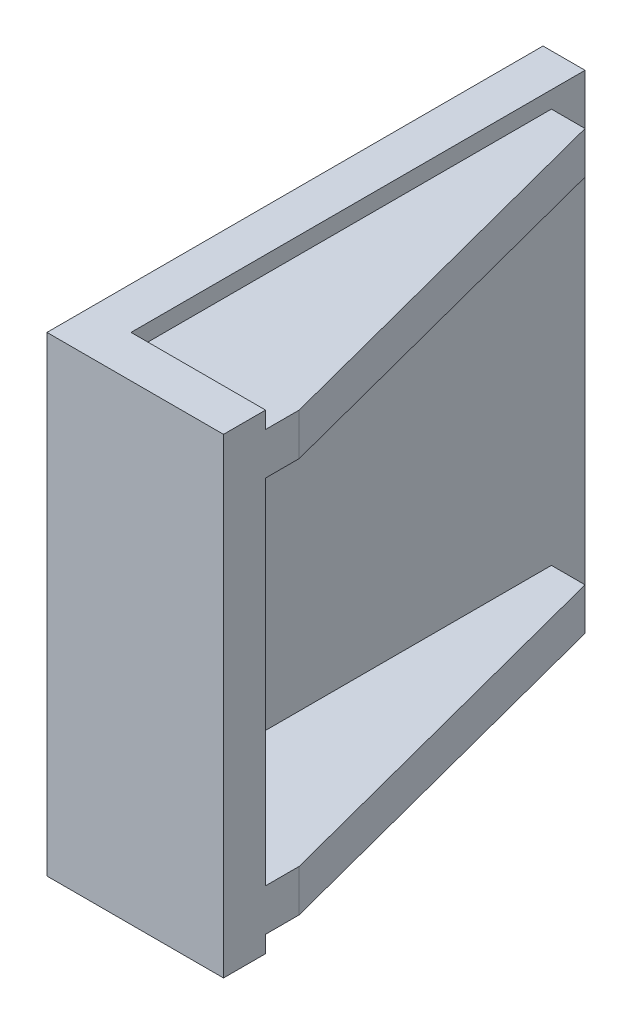
ISO-10303-21;
HEADER;
FILE_DESCRIPTION(('STEP AP214'),'2;1');
FILE_NAME('part.step','',(''),(''),'','','');
FILE_SCHEMA(('AUTOMOTIVE_DESIGN { 1 0 10303 214 1 1 1 1 }'));
ENDSEC;
DATA;
#1=APPLICATION_CONTEXT('core data for automotive mechanical design processes');
#2=APPLICATION_PROTOCOL_DEFINITION('international standard','automotive_design',2000,#1);
#3=PRODUCT_CONTEXT('',#1,'mechanical');
#4=PRODUCT('Part','Part','',(#3));
#5=PRODUCT_RELATED_PRODUCT_CATEGORY('part','',(#4));
#6=PRODUCT_DEFINITION_FORMATION('','',#4);
#7=PRODUCT_DEFINITION_CONTEXT('part definition',#1,'design');
#8=PRODUCT_DEFINITION('design','',#6,#7);
#9=PRODUCT_DEFINITION_SHAPE('','',#8);
#10=(LENGTH_UNIT() NAMED_UNIT(*) SI_UNIT(.MILLI.,.METRE.));
#11=(NAMED_UNIT(*) PLANE_ANGLE_UNIT() SI_UNIT($,.RADIAN.));
#12=(NAMED_UNIT(*) SI_UNIT($,.STERADIAN.) SOLID_ANGLE_UNIT());
#13=UNCERTAINTY_MEASURE_WITH_UNIT(LENGTH_MEASURE(1.E-05),#10,'distance_accuracy_value','');
#14=(GEOMETRIC_REPRESENTATION_CONTEXT(3) GLOBAL_UNCERTAINTY_ASSIGNED_CONTEXT((#13)) GLOBAL_UNIT_ASSIGNED_CONTEXT((#10,
#11,#12)) REPRESENTATION_CONTEXT('',''));
#15=CARTESIAN_POINT('',(0.,0.,0.));
#16=DIRECTION('',(0.,0.,1.));
#17=DIRECTION('',(1.,0.,0.));
#18=AXIS2_PLACEMENT_3D('',#15,#16,#17);
#19=CARTESIAN_POINT('',(12.5,-223.815273071201,122.5));
#20=DIRECTION('',(0.,0.,-1.));
#21=DIRECTION('',(-1.,0.,0.));
#22=AXIS2_PLACEMENT_3D('',#19,#20,#21);
#23=PLANE('',#22);
#24=DIRECTION('',(0.,1.,0.));
#25=VECTOR('',#24,1.);
#26=CARTESIAN_POINT('',(12.5,-223.815273071201,122.5));
#27=LINE('',#26,#25);
#28=CARTESIAN_POINT('',(12.5,-140.,122.5));
#29=VERTEX_POINT('',#28);
#30=CARTESIAN_POINT('',(12.5,-130.,122.5));
#31=VERTEX_POINT('',#30);
#32=EDGE_CURVE('E228',#29,#31,#27,.T.);
#33=ORIENTED_EDGE('',*,*,#32,.T.);
#34=DIRECTION('',(1.,0.,0.));
#35=VECTOR('',#34,1.);
#36=CARTESIAN_POINT('',(92.5,-130.,122.5));
#37=LINE('',#36,#35);
#38=CARTESIAN_POINT('',(92.5,-130.,122.5));
#39=VERTEX_POINT('',#38);
#40=EDGE_CURVE('E173',#31,#39,#37,.T.);
#41=ORIENTED_EDGE('',*,*,#40,.T.);
#42=DIRECTION('',(0.,1.,0.));
#43=VECTOR('',#42,1.);
#44=CARTESIAN_POINT('',(92.5,-223.815273071201,122.5));
#45=LINE('',#44,#43);
#46=CARTESIAN_POINT('',(92.5,-140.,122.5));
#47=VERTEX_POINT('',#46);
#48=EDGE_CURVE('E240',#47,#39,#45,.T.);
#49=ORIENTED_EDGE('',*,*,#48,.F.);
#50=DIRECTION('',(1.,0.,0.));
#51=VECTOR('',#50,1.);
#52=CARTESIAN_POINT('',(12.5,-140.,122.5));
#53=LINE('',#52,#51);
#54=EDGE_CURVE('E227',#29,#47,#53,.T.);
#55=ORIENTED_EDGE('',*,*,#54,.F.);
#56=EDGE_LOOP('',(#33,#41,#49,#55));
#57=FACE_BOUND('',#56,.T.);
#58=ADVANCED_FACE('F35',(#57),#23,.T.);
#59=CARTESIAN_POINT('',(92.5,130.,122.5));
#60=VERTEX_POINT('',#59);
#61=CARTESIAN_POINT('',(92.5,140.,122.5));
#62=VERTEX_POINT('',#61);
#63=EDGE_CURVE('E244',#60,#62,#45,.T.);
#64=ORIENTED_EDGE('',*,*,#63,.F.);
#65=DIRECTION('',(1.,0.,0.));
#66=VECTOR('',#65,1.);
#67=CARTESIAN_POINT('',(92.5,130.,122.5));
#68=LINE('',#67,#66);
#69=CARTESIAN_POINT('',(12.5,130.,122.5));
#70=VERTEX_POINT('',#69);
#71=EDGE_CURVE('E58',#70,#60,#68,.T.);
#72=ORIENTED_EDGE('',*,*,#71,.F.);
#73=CARTESIAN_POINT('',(12.5,140.,122.5));
#74=VERTEX_POINT('',#73);
#75=EDGE_CURVE('E239',#70,#74,#27,.T.);
#76=ORIENTED_EDGE('',*,*,#75,.T.);
#77=DIRECTION('',(-1.,0.,0.));
#78=VECTOR('',#77,1.);
#79=CARTESIAN_POINT('',(12.5,140.,122.5));
#80=LINE('',#79,#78);
#81=EDGE_CURVE('E233',#62,#74,#80,.T.);
#82=ORIENTED_EDGE('',*,*,#81,.F.);
#83=EDGE_LOOP('',(#64,#72,#76,#82));
#84=FACE_BOUND('',#83,.T.);
#85=ADVANCED_FACE('F293',(#84),#23,.T.);
#86=CARTESIAN_POINT('',(12.5,140.,147.5));
#87=DIRECTION('',(-1.,0.,0.));
#88=DIRECTION('',(0.,-1.,0.));
#89=AXIS2_PLACEMENT_3D('',#86,#87,#88);
#90=PLANE('',#89);
#91=CARTESIAN_POINT('',(12.5,-105.,122.5));
#92=VERTEX_POINT('',#91);
#93=CARTESIAN_POINT('',(12.5,105.,122.5));
#94=VERTEX_POINT('',#93);
#95=EDGE_CURVE('E172',#92,#94,#27,.T.);
#96=ORIENTED_EDGE('',*,*,#95,.F.);
#97=DIRECTION('',(0.,0.,1.));
#98=VECTOR('',#97,1.);
#99=CARTESIAN_POINT('',(12.5,-105.,122.5));
#100=LINE('',#99,#98);
#101=CARTESIAN_POINT('',(12.5,-105.,-127.5));
#102=VERTEX_POINT('',#101);
#103=EDGE_CURVE('E151',#102,#92,#100,.T.);
#104=ORIENTED_EDGE('',*,*,#103,.F.);
#105=DIRECTION('',(0.,-1.,0.));
#106=VECTOR('',#105,1.);
#107=CARTESIAN_POINT('',(12.5,-105.,-127.5));
#108=LINE('',#107,#106);
#109=CARTESIAN_POINT('',(12.5,-130.,-127.5));
#110=VERTEX_POINT('',#109);
#111=EDGE_CURVE('E160',#102,#110,#108,.T.);
#112=ORIENTED_EDGE('',*,*,#111,.T.);
#113=DIRECTION('',(0.,0.,1.));
#114=VECTOR('',#113,1.);
#115=CARTESIAN_POINT('',(12.5,-130.,122.5));
#116=LINE('',#115,#114);
#117=EDGE_CURVE('E182',#110,#31,#116,.T.);
#118=ORIENTED_EDGE('',*,*,#117,.T.);
#119=ORIENTED_EDGE('',*,*,#32,.F.);
#120=DIRECTION('',(0.,0.,-1.));
#121=VECTOR('',#120,1.);
#122=CARTESIAN_POINT('',(12.5,-140.,147.5));
#123=LINE('',#122,#121);
#124=CARTESIAN_POINT('',(12.5,-140.,-147.5));
#125=VERTEX_POINT('',#124);
#126=EDGE_CURVE('E254',#29,#125,#123,.T.);
#127=ORIENTED_EDGE('',*,*,#126,.T.);
#128=DIRECTION('',(0.,1.,0.));
#129=VECTOR('',#128,1.);
#130=CARTESIAN_POINT('',(12.5,140.,-147.5));
#131=LINE('',#130,#129);
#132=CARTESIAN_POINT('',(12.5,140.,-147.5));
#133=VERTEX_POINT('',#132);
#134=EDGE_CURVE('E230',#125,#133,#131,.T.);
#135=ORIENTED_EDGE('',*,*,#134,.T.);
#136=DIRECTION('',(0.,0.,-1.));
#137=VECTOR('',#136,1.);
#138=CARTESIAN_POINT('',(12.5,140.,147.5));
#139=LINE('',#138,#137);
#140=EDGE_CURVE('E11',#74,#133,#139,.T.);
#141=ORIENTED_EDGE('',*,*,#140,.F.);
#142=ORIENTED_EDGE('',*,*,#75,.F.);
#143=DIRECTION('',(0.,0.,1.));
#144=VECTOR('',#143,1.);
#145=CARTESIAN_POINT('',(12.5,130.,122.5));
#146=LINE('',#145,#144);
#147=CARTESIAN_POINT('',(12.5,130.,-127.5));
#148=VERTEX_POINT('',#147);
#149=EDGE_CURVE('E191',#148,#70,#146,.T.);
#150=ORIENTED_EDGE('',*,*,#149,.F.);
#151=DIRECTION('',(0.,1.,0.));
#152=VECTOR('',#151,1.);
#153=CARTESIAN_POINT('',(12.5,105.,-127.5));
#154=LINE('',#153,#152);
#155=CARTESIAN_POINT('',(12.5,105.,-127.5));
#156=VERTEX_POINT('',#155);
#157=EDGE_CURVE('E218',#156,#148,#154,.T.);
#158=ORIENTED_EDGE('',*,*,#157,.F.);
#159=DIRECTION('',(0.,0.,1.));
#160=VECTOR('',#159,1.);
#161=CARTESIAN_POINT('',(12.5,105.,122.5));
#162=LINE('',#161,#160);
#163=EDGE_CURVE('E193',#156,#94,#162,.T.);
#164=ORIENTED_EDGE('',*,*,#163,.T.);
#165=EDGE_LOOP('',(#96,#104,#112,#118,#119,#127,#135,#141,#142,#150,#158,#164));
#166=FACE_BOUND('',#165,.T.);
#167=ADVANCED_FACE('F37',(#166),#90,.F.);
#168=CARTESIAN_POINT('',(-12.5,140.,147.5));
#169=DIRECTION('',(0.,-1.,0.));
#170=DIRECTION('',(0.,0.,-1.));
#171=AXIS2_PLACEMENT_3D('',#168,#169,#170);
#172=PLANE('',#171);
#173=DIRECTION('',(-1.,0.,0.));
#174=VECTOR('',#173,1.);
#175=CARTESIAN_POINT('',(-12.5,140.,-147.5));
#176=LINE('',#175,#174);
#177=CARTESIAN_POINT('',(-12.5,140.,-147.5));
#178=VERTEX_POINT('',#177);
#179=EDGE_CURVE('E257',#133,#178,#176,.T.);
#180=ORIENTED_EDGE('',*,*,#179,.T.);
#181=DIRECTION('',(0.,0.,-1.));
#182=VECTOR('',#181,1.);
#183=CARTESIAN_POINT('',(-12.5,140.,147.5));
#184=LINE('',#183,#182);
#185=CARTESIAN_POINT('',(-12.5,140.,147.5));
#186=VERTEX_POINT('',#185);
#187=EDGE_CURVE('E43',#186,#178,#184,.T.);
#188=ORIENTED_EDGE('',*,*,#187,.F.);
#189=DIRECTION('',(-1.,0.,0.));
#190=VECTOR('',#189,1.);
#191=CARTESIAN_POINT('',(-12.5,140.,147.5));
#192=LINE('',#191,#190);
#193=CARTESIAN_POINT('',(92.5,140.,147.5));
#194=VERTEX_POINT('',#193);
#195=EDGE_CURVE('E247',#194,#186,#192,.T.);
#196=ORIENTED_EDGE('',*,*,#195,.F.);
#197=DIRECTION('',(0.,0.,-1.));
#198=VECTOR('',#197,1.);
#199=CARTESIAN_POINT('',(92.5,140.,147.5));
#200=LINE('',#199,#198);
#201=EDGE_CURVE('E220',#194,#62,#200,.T.);
#202=ORIENTED_EDGE('',*,*,#201,.T.);
#203=ORIENTED_EDGE('',*,*,#81,.T.);
#204=ORIENTED_EDGE('',*,*,#140,.T.);
#205=EDGE_LOOP('',(#180,#188,#196,#202,#203,#204));
#206=FACE_BOUND('',#205,.T.);
#207=ADVANCED_FACE('F289',(#206),#172,.F.);
#208=CARTESIAN_POINT('',(-12.5,140.,147.5));
#209=DIRECTION('',(1.,0.,0.));
#210=DIRECTION('',(0.,1.,0.));
#211=AXIS2_PLACEMENT_3D('',#208,#209,#210);
#212=PLANE('',#211);
#213=DIRECTION('',(0.,-1.,0.));
#214=VECTOR('',#213,1.);
#215=CARTESIAN_POINT('',(-12.5,140.,-147.5));
#216=LINE('',#215,#214);
#217=CARTESIAN_POINT('',(-12.5,-140.,-147.5));
#218=VERTEX_POINT('',#217);
#219=EDGE_CURVE('E259',#178,#218,#216,.T.);
#220=ORIENTED_EDGE('',*,*,#219,.T.);
#221=DIRECTION('',(0.,0.,-1.));
#222=VECTOR('',#221,1.);
#223=CARTESIAN_POINT('',(-12.5,-140.,147.5));
#224=LINE('',#223,#222);
#225=CARTESIAN_POINT('',(-12.5,-140.,147.5));
#226=VERTEX_POINT('',#225);
#227=EDGE_CURVE('E264',#226,#218,#224,.T.);
#228=ORIENTED_EDGE('',*,*,#227,.F.);
#229=DIRECTION('',(0.,-1.,0.));
#230=VECTOR('',#229,1.);
#231=CARTESIAN_POINT('',(-12.5,140.,147.5));
#232=LINE('',#231,#230);
#233=EDGE_CURVE('E249',#186,#226,#232,.T.);
#234=ORIENTED_EDGE('',*,*,#233,.F.);
#235=ORIENTED_EDGE('',*,*,#187,.T.);
#236=EDGE_LOOP('',(#220,#228,#234,#235));
#237=FACE_BOUND('',#236,.T.);
#238=ADVANCED_FACE('F271',(#237),#212,.F.);
#239=CARTESIAN_POINT('',(-12.5,-140.,147.5));
#240=DIRECTION('',(0.,1.,0.));
#241=DIRECTION('',(0.,0.,1.));
#242=AXIS2_PLACEMENT_3D('',#239,#240,#241);
#243=PLANE('',#242);
#244=DIRECTION('',(1.,0.,0.));
#245=VECTOR('',#244,1.);
#246=CARTESIAN_POINT('',(-12.5,-140.,-147.5));
#247=LINE('',#246,#245);
#248=EDGE_CURVE('E250',#218,#125,#247,.T.);
#249=ORIENTED_EDGE('',*,*,#248,.T.);
#250=ORIENTED_EDGE('',*,*,#126,.F.);
#251=ORIENTED_EDGE('',*,*,#54,.T.);
#252=DIRECTION('',(0.,0.,1.));
#253=VECTOR('',#252,1.);
#254=CARTESIAN_POINT('',(92.5,-140.,147.5));
#255=LINE('',#254,#253);
#256=CARTESIAN_POINT('',(92.5,-140.,147.5));
#257=VERTEX_POINT('',#256);
#258=EDGE_CURVE('E224',#47,#257,#255,.T.);
#259=ORIENTED_EDGE('',*,*,#258,.T.);
#260=DIRECTION('',(1.,0.,0.));
#261=VECTOR('',#260,1.);
#262=CARTESIAN_POINT('',(-12.5,-140.,147.5));
#263=LINE('',#262,#261);
#264=EDGE_CURVE('E252',#226,#257,#263,.T.);
#265=ORIENTED_EDGE('',*,*,#264,.F.);
#266=ORIENTED_EDGE('',*,*,#227,.T.);
#267=EDGE_LOOP('',(#249,#250,#251,#259,#265,#266));
#268=FACE_BOUND('',#267,.T.);
#269=ADVANCED_FACE('F281',(#268),#243,.F.);
#270=CARTESIAN_POINT('',(0.,0.,147.5));
#271=DIRECTION('',(0.,0.,1.));
#272=DIRECTION('',(1.,0.,0.));
#273=AXIS2_PLACEMENT_3D('',#270,#271,#272);
#274=PLANE('',#273);
#275=ORIENTED_EDGE('',*,*,#264,.T.);
#276=DIRECTION('',(0.,1.,0.));
#277=VECTOR('',#276,1.);
#278=CARTESIAN_POINT('',(92.5,-223.815273071201,147.5));
#279=LINE('',#278,#277);
#280=EDGE_CURVE('E236',#257,#194,#279,.T.);
#281=ORIENTED_EDGE('',*,*,#280,.T.);
#282=ORIENTED_EDGE('',*,*,#195,.T.);
#283=ORIENTED_EDGE('',*,*,#233,.T.);
#284=EDGE_LOOP('',(#275,#281,#282,#283));
#285=FACE_BOUND('',#284,.T.);
#286=ADVANCED_FACE('F287',(#285),#274,.T.);
#287=CARTESIAN_POINT('',(0.,0.,-147.5));
#288=DIRECTION('',(0.,0.,1.));
#289=DIRECTION('',(1.,0.,0.));
#290=AXIS2_PLACEMENT_3D('',#287,#288,#289);
#291=PLANE('',#290);
#292=ORIENTED_EDGE('',*,*,#134,.F.);
#293=ORIENTED_EDGE('',*,*,#248,.F.);
#294=ORIENTED_EDGE('',*,*,#219,.F.);
#295=ORIENTED_EDGE('',*,*,#179,.F.);
#296=EDGE_LOOP('',(#292,#293,#294,#295));
#297=FACE_BOUND('',#296,.T.);
#298=ADVANCED_FACE('F278',(#297),#291,.F.);
#299=DIRECTION('',(1.,0.,0.));
#300=VECTOR('',#299,1.);
#301=CARTESIAN_POINT('',(92.5,-105.,122.5));
#302=LINE('',#301,#300);
#303=CARTESIAN_POINT('',(92.5,-105.,122.5));
#304=VERTEX_POINT('',#303);
#305=EDGE_CURVE('E168',#92,#304,#302,.T.);
#306=ORIENTED_EDGE('',*,*,#305,.F.);
#307=ORIENTED_EDGE('',*,*,#95,.T.);
#308=DIRECTION('',(1.,0.,0.));
#309=VECTOR('',#308,1.);
#310=CARTESIAN_POINT('',(92.5,105.,122.5));
#311=LINE('',#310,#309);
#312=CARTESIAN_POINT('',(92.5,105.,122.5));
#313=VERTEX_POINT('',#312);
#314=EDGE_CURVE('E195',#94,#313,#311,.T.);
#315=ORIENTED_EDGE('',*,*,#314,.T.);
#316=EDGE_CURVE('E243',#304,#313,#45,.T.);
#317=ORIENTED_EDGE('',*,*,#316,.F.);
#318=EDGE_LOOP('',(#306,#307,#315,#317));
#319=FACE_BOUND('',#318,.T.);
#320=ADVANCED_FACE('F314',(#319),#23,.T.);
#321=CARTESIAN_POINT('',(92.5,-223.815273071201,147.5));
#322=DIRECTION('',(1.,0.,0.));
#323=DIRECTION('',(0.,0.,-1.));
#324=AXIS2_PLACEMENT_3D('',#321,#322,#323);
#325=PLANE('',#324);
#326=ORIENTED_EDGE('',*,*,#258,.F.);
#327=ORIENTED_EDGE('',*,*,#48,.T.);
#328=DIRECTION('',(0.,0.,-1.));
#329=VECTOR('',#328,1.);
#330=CARTESIAN_POINT('',(92.5,-130.,102.5));
#331=LINE('',#330,#329);
#332=CARTESIAN_POINT('',(92.5,-130.,102.5));
#333=VERTEX_POINT('',#332);
#334=EDGE_CURVE('E176',#39,#333,#331,.T.);
#335=ORIENTED_EDGE('',*,*,#334,.T.);
#336=DIRECTION('',(0.,-1.,0.));
#337=VECTOR('',#336,1.);
#338=CARTESIAN_POINT('',(92.5,-105.,102.5));
#339=LINE('',#338,#337);
#340=CARTESIAN_POINT('',(92.5,-105.,102.5));
#341=VERTEX_POINT('',#340);
#342=EDGE_CURVE('E188',#341,#333,#339,.T.);
#343=ORIENTED_EDGE('',*,*,#342,.F.);
#344=DIRECTION('',(0.,0.,-1.));
#345=VECTOR('',#344,1.);
#346=CARTESIAN_POINT('',(92.5,-105.,102.5));
#347=LINE('',#346,#345);
#348=EDGE_CURVE('E50',#304,#341,#347,.T.);
#349=ORIENTED_EDGE('',*,*,#348,.F.);
#350=ORIENTED_EDGE('',*,*,#316,.T.);
#351=DIRECTION('',(0.,0.,-1.));
#352=VECTOR('',#351,1.);
#353=CARTESIAN_POINT('',(92.5,105.,102.5));
#354=LINE('',#353,#352);
#355=CARTESIAN_POINT('',(92.5,105.,102.5));
#356=VERTEX_POINT('',#355);
#357=EDGE_CURVE('E199',#313,#356,#354,.T.);
#358=ORIENTED_EDGE('',*,*,#357,.T.);
#359=DIRECTION('',(0.,1.,0.));
#360=VECTOR('',#359,1.);
#361=CARTESIAN_POINT('',(92.5,105.,102.5));
#362=LINE('',#361,#360);
#363=CARTESIAN_POINT('',(92.5,130.,102.5));
#364=VERTEX_POINT('',#363);
#365=EDGE_CURVE('E208',#356,#364,#362,.T.);
#366=ORIENTED_EDGE('',*,*,#365,.T.);
#367=DIRECTION('',(0.,0.,-1.));
#368=VECTOR('',#367,1.);
#369=CARTESIAN_POINT('',(92.5,130.,102.5));
#370=LINE('',#369,#368);
#371=EDGE_CURVE('E211',#60,#364,#370,.T.);
#372=ORIENTED_EDGE('',*,*,#371,.F.);
#373=ORIENTED_EDGE('',*,*,#63,.T.);
#374=ORIENTED_EDGE('',*,*,#201,.F.);
#375=ORIENTED_EDGE('',*,*,#280,.F.);
#376=EDGE_LOOP('',(#326,#327,#335,#343,#349,#350,#358,#366,#372,#373,#374,#375));
#377=FACE_BOUND('',#376,.T.);
#378=ADVANCED_FACE('F299',(#377),#325,.T.);
#379=CARTESIAN_POINT('',(12.5,105.,-127.5));
#380=DIRECTION('',(0.,0.,-1.));
#381=DIRECTION('',(-1.,0.,0.));
#382=AXIS2_PLACEMENT_3D('',#379,#380,#381);
#383=PLANE('',#382);
#384=DIRECTION('',(-1.,0.,0.));
#385=VECTOR('',#384,1.);
#386=CARTESIAN_POINT('',(12.5,130.,-127.5));
#387=LINE('',#386,#385);
#388=CARTESIAN_POINT('',(32.5,130.,-127.5));
#389=VERTEX_POINT('',#388);
#390=EDGE_CURVE('E196',#389,#148,#387,.T.);
#391=ORIENTED_EDGE('',*,*,#390,.F.);
#392=DIRECTION('',(0.,1.,0.));
#393=VECTOR('',#392,1.);
#394=CARTESIAN_POINT('',(32.5,105.,-127.5));
#395=LINE('',#394,#393);
#396=CARTESIAN_POINT('',(32.5,105.,-127.5));
#397=VERTEX_POINT('',#396);
#398=EDGE_CURVE('E221',#397,#389,#395,.T.);
#399=ORIENTED_EDGE('',*,*,#398,.F.);
#400=DIRECTION('',(-1.,0.,0.));
#401=VECTOR('',#400,1.);
#402=CARTESIAN_POINT('',(12.5,105.,-127.5));
#403=LINE('',#402,#401);
#404=EDGE_CURVE('E205',#397,#156,#403,.T.);
#405=ORIENTED_EDGE('',*,*,#404,.T.);
#406=ORIENTED_EDGE('',*,*,#157,.T.);
#407=EDGE_LOOP('',(#391,#399,#405,#406));
#408=FACE_BOUND('',#407,.T.);
#409=ADVANCED_FACE('F326',(#408),#383,.T.);
#410=CARTESIAN_POINT('',(32.5,105.,-127.5));
#411=DIRECTION('',(0.967617272396844,0.,-0.252421897147003));
#412=DIRECTION('',(-0.252421897147003,0.,-0.967617272396844));
#413=AXIS2_PLACEMENT_3D('',#410,#411,#412);
#414=PLANE('',#413);
#415=DIRECTION('',(-0.252421897147003,0.,-0.967617272396844));
#416=VECTOR('',#415,1.);
#417=CARTESIAN_POINT('',(32.5,130.,-127.5));
#418=LINE('',#417,#416);
#419=EDGE_CURVE('E213',#364,#389,#418,.T.);
#420=ORIENTED_EDGE('',*,*,#419,.F.);
#421=ORIENTED_EDGE('',*,*,#365,.F.);
#422=DIRECTION('',(-0.252421897147003,0.,-0.967617272396844));
#423=VECTOR('',#422,1.);
#424=CARTESIAN_POINT('',(32.5,105.,-127.5));
#425=LINE('',#424,#423);
#426=EDGE_CURVE('E202',#356,#397,#425,.T.);
#427=ORIENTED_EDGE('',*,*,#426,.T.);
#428=ORIENTED_EDGE('',*,*,#398,.T.);
#429=EDGE_LOOP('',(#420,#421,#427,#428));
#430=FACE_BOUND('',#429,.T.);
#431=ADVANCED_FACE('F341',(#430),#414,.T.);
#432=CARTESIAN_POINT('',(0.,105.,0.));
#433=DIRECTION('',(0.,-1.,0.));
#434=DIRECTION('',(0.,0.,-1.));
#435=AXIS2_PLACEMENT_3D('',#432,#433,#434);
#436=PLANE('',#435);
#437=ORIENTED_EDGE('',*,*,#163,.F.);
#438=ORIENTED_EDGE('',*,*,#404,.F.);
#439=ORIENTED_EDGE('',*,*,#426,.F.);
#440=ORIENTED_EDGE('',*,*,#357,.F.);
#441=ORIENTED_EDGE('',*,*,#314,.F.);
#442=EDGE_LOOP('',(#437,#438,#439,#440,#441));
#443=FACE_BOUND('',#442,.T.);
#444=ADVANCED_FACE('F339',(#443),#436,.T.);
#445=CARTESIAN_POINT('',(0.,130.,0.));
#446=DIRECTION('',(0.,-1.,0.));
#447=DIRECTION('',(0.,0.,-1.));
#448=AXIS2_PLACEMENT_3D('',#445,#446,#447);
#449=PLANE('',#448);
#450=ORIENTED_EDGE('',*,*,#149,.T.);
#451=ORIENTED_EDGE('',*,*,#71,.T.);
#452=ORIENTED_EDGE('',*,*,#371,.T.);
#453=ORIENTED_EDGE('',*,*,#419,.T.);
#454=ORIENTED_EDGE('',*,*,#390,.T.);
#455=EDGE_LOOP('',(#450,#451,#452,#453,#454));
#456=FACE_BOUND('',#455,.T.);
#457=ADVANCED_FACE('F332',(#456),#449,.F.);
#458=CARTESIAN_POINT('',(32.5,-105.,-127.5));
#459=DIRECTION('',(-0.967617272396844,0.,0.252421897147003));
#460=DIRECTION('',(0.252421897147003,0.,0.967617272396844));
#461=AXIS2_PLACEMENT_3D('',#458,#459,#460);
#462=PLANE('',#461);
#463=DIRECTION('',(-0.252421897147003,0.,-0.967617272396844));
#464=VECTOR('',#463,1.);
#465=CARTESIAN_POINT('',(32.5,-130.,-127.5));
#466=LINE('',#465,#464);
#467=CARTESIAN_POINT('',(32.5,-130.,-127.5));
#468=VERTEX_POINT('',#467);
#469=EDGE_CURVE('E185',#333,#468,#466,.T.);
#470=ORIENTED_EDGE('',*,*,#469,.T.);
#471=DIRECTION('',(0.,-1.,0.));
#472=VECTOR('',#471,1.);
#473=CARTESIAN_POINT('',(32.5,-105.,-127.5));
#474=LINE('',#473,#472);
#475=CARTESIAN_POINT('',(32.5,-105.,-127.5));
#476=VERTEX_POINT('',#475);
#477=EDGE_CURVE('E167',#476,#468,#474,.T.);
#478=ORIENTED_EDGE('',*,*,#477,.F.);
#479=DIRECTION('',(-0.252421897147003,0.,-0.967617272396844));
#480=VECTOR('',#479,1.);
#481=CARTESIAN_POINT('',(32.5,-105.,-127.5));
#482=LINE('',#481,#480);
#483=EDGE_CURVE('E154',#341,#476,#482,.T.);
#484=ORIENTED_EDGE('',*,*,#483,.F.);
#485=ORIENTED_EDGE('',*,*,#342,.T.);
#486=EDGE_LOOP('',(#470,#478,#484,#485));
#487=FACE_BOUND('',#486,.T.);
#488=ADVANCED_FACE('F303',(#487),#462,.F.);
#489=CARTESIAN_POINT('',(12.5,-105.,-127.5));
#490=DIRECTION('',(0.,0.,1.));
#491=DIRECTION('',(1.,0.,0.));
#492=AXIS2_PLACEMENT_3D('',#489,#490,#491);
#493=PLANE('',#492);
#494=DIRECTION('',(-1.,0.,0.));
#495=VECTOR('',#494,1.);
#496=CARTESIAN_POINT('',(12.5,-130.,-127.5));
#497=LINE('',#496,#495);
#498=EDGE_CURVE('E163',#468,#110,#497,.T.);
#499=ORIENTED_EDGE('',*,*,#498,.T.);
#500=ORIENTED_EDGE('',*,*,#111,.F.);
#501=DIRECTION('',(-1.,0.,0.));
#502=VECTOR('',#501,1.);
#503=CARTESIAN_POINT('',(12.5,-105.,-127.5));
#504=LINE('',#503,#502);
#505=EDGE_CURVE('E147',#476,#102,#504,.T.);
#506=ORIENTED_EDGE('',*,*,#505,.F.);
#507=ORIENTED_EDGE('',*,*,#477,.T.);
#508=EDGE_LOOP('',(#499,#500,#506,#507));
#509=FACE_BOUND('',#508,.T.);
#510=ADVANCED_FACE('F161',(#509),#493,.F.);
#511=CARTESIAN_POINT('',(0.,-105.,0.));
#512=DIRECTION('',(0.,1.,0.));
#513=DIRECTION('',(0.,0.,-1.));
#514=AXIS2_PLACEMENT_3D('',#511,#512,#513);
#515=PLANE('',#514);
#516=ORIENTED_EDGE('',*,*,#103,.T.);
#517=ORIENTED_EDGE('',*,*,#305,.T.);
#518=ORIENTED_EDGE('',*,*,#348,.T.);
#519=ORIENTED_EDGE('',*,*,#483,.T.);
#520=ORIENTED_EDGE('',*,*,#505,.T.);
#521=EDGE_LOOP('',(#516,#517,#518,#519,#520));
#522=FACE_BOUND('',#521,.T.);
#523=ADVANCED_FACE('F149',(#522),#515,.T.);
#524=CARTESIAN_POINT('',(0.,-130.,0.));
#525=DIRECTION('',(0.,1.,0.));
#526=DIRECTION('',(0.,0.,-1.));
#527=AXIS2_PLACEMENT_3D('',#524,#525,#526);
#528=PLANE('',#527);
#529=ORIENTED_EDGE('',*,*,#117,.F.);
#530=ORIENTED_EDGE('',*,*,#498,.F.);
#531=ORIENTED_EDGE('',*,*,#469,.F.);
#532=ORIENTED_EDGE('',*,*,#334,.F.);
#533=ORIENTED_EDGE('',*,*,#40,.F.);
#534=EDGE_LOOP('',(#529,#530,#531,#532,#533));
#535=FACE_BOUND('',#534,.T.);
#536=ADVANCED_FACE('F304',(#535),#528,.F.);
#537=CLOSED_SHELL('',(#58,#85,#167,#207,#238,#269,#286,#298,#320,#378,#409,#431,#444,#457,#488,
#510,#523,#536));
#538=MANIFOLD_SOLID_BREP('B2',#537);
#539=ADVANCED_BREP_SHAPE_REPRESENTATION('',(#18,#538),#14);
#540=SHAPE_DEFINITION_REPRESENTATION(#9,#539);
ENDSEC;
END-ISO-10303-21;
